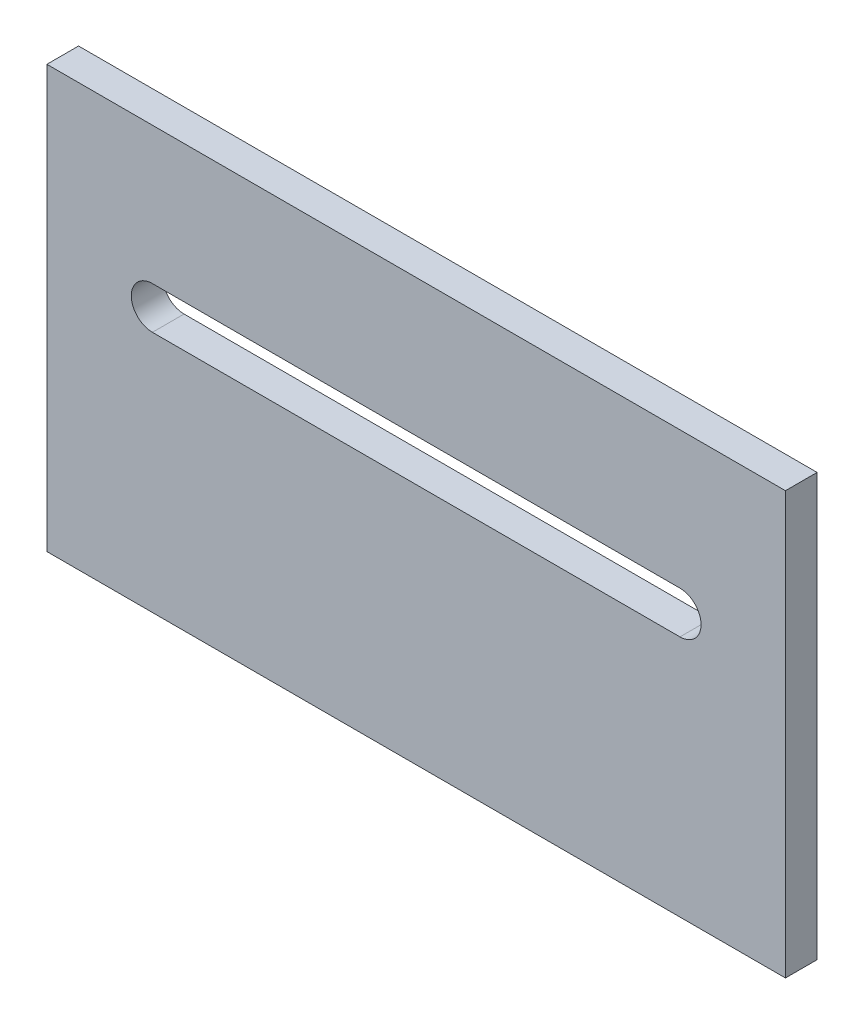
ISO-10303-21;
HEADER;
FILE_DESCRIPTION(('STEP AP214'),'2;1');
FILE_NAME('part.step','',(''),(''),'','','');
FILE_SCHEMA(('AUTOMOTIVE_DESIGN { 1 0 10303 214 1 1 1 1 }'));
ENDSEC;
DATA;
#1=APPLICATION_CONTEXT('core data for automotive mechanical design processes');
#2=APPLICATION_PROTOCOL_DEFINITION('international standard','automotive_design',2000,#1);
#3=PRODUCT_CONTEXT('',#1,'mechanical');
#4=PRODUCT('Part','Part','',(#3));
#5=PRODUCT_RELATED_PRODUCT_CATEGORY('part','',(#4));
#6=PRODUCT_DEFINITION_FORMATION('','',#4);
#7=PRODUCT_DEFINITION_CONTEXT('part definition',#1,'design');
#8=PRODUCT_DEFINITION('design','',#6,#7);
#9=PRODUCT_DEFINITION_SHAPE('','',#8);
#10=(LENGTH_UNIT() NAMED_UNIT(*) SI_UNIT(.MILLI.,.METRE.));
#11=(NAMED_UNIT(*) PLANE_ANGLE_UNIT() SI_UNIT($,.RADIAN.));
#12=(NAMED_UNIT(*) SI_UNIT($,.STERADIAN.) SOLID_ANGLE_UNIT());
#13=UNCERTAINTY_MEASURE_WITH_UNIT(LENGTH_MEASURE(1.E-05),#10,'distance_accuracy_value','');
#14=(GEOMETRIC_REPRESENTATION_CONTEXT(3) GLOBAL_UNCERTAINTY_ASSIGNED_CONTEXT((#13)) GLOBAL_UNIT_ASSIGNED_CONTEXT((#10,
#11,#12)) REPRESENTATION_CONTEXT('',''));
#15=CARTESIAN_POINT('',(0.,0.,0.));
#16=DIRECTION('',(0.,0.,1.));
#17=DIRECTION('',(1.,0.,0.));
#18=AXIS2_PLACEMENT_3D('',#15,#16,#17);
#19=CARTESIAN_POINT('',(0.,0.,3.));
#20=DIRECTION('',(1.,0.,0.));
#21=DIRECTION('',(0.,0.,-1.));
#22=AXIS2_PLACEMENT_3D('',#19,#20,#21);
#23=PLANE('',#22);
#24=DIRECTION('',(0.,-1.,0.));
#25=VECTOR('',#24,1.);
#26=CARTESIAN_POINT('',(0.,0.,0.));
#27=LINE('',#26,#25);
#28=CARTESIAN_POINT('',(0.,0.,0.));
#29=VERTEX_POINT('',#28);
#30=CARTESIAN_POINT('',(0.,-40.,0.));
#31=VERTEX_POINT('',#30);
#32=EDGE_CURVE('E134',#29,#31,#27,.T.);
#33=ORIENTED_EDGE('',*,*,#32,.T.);
#34=DIRECTION('',(0.,0.,-1.));
#35=VECTOR('',#34,1.);
#36=CARTESIAN_POINT('',(0.,-40.,3.));
#37=LINE('',#36,#35);
#38=CARTESIAN_POINT('',(0.,-40.,3.));
#39=VERTEX_POINT('',#38);
#40=EDGE_CURVE('E11',#39,#31,#37,.T.);
#41=ORIENTED_EDGE('',*,*,#40,.F.);
#42=DIRECTION('',(0.,-1.,0.));
#43=VECTOR('',#42,1.);
#44=CARTESIAN_POINT('',(0.,0.,3.));
#45=LINE('',#44,#43);
#46=CARTESIAN_POINT('',(0.,0.,3.));
#47=VERTEX_POINT('',#46);
#48=EDGE_CURVE('E138',#47,#39,#45,.T.);
#49=ORIENTED_EDGE('',*,*,#48,.F.);
#50=DIRECTION('',(0.,0.,-1.));
#51=VECTOR('',#50,1.);
#52=CARTESIAN_POINT('',(0.,0.,3.));
#53=LINE('',#52,#51);
#54=EDGE_CURVE('E148',#47,#29,#53,.T.);
#55=ORIENTED_EDGE('',*,*,#54,.T.);
#56=EDGE_LOOP('',(#33,#41,#49,#55));
#57=FACE_BOUND('',#56,.T.);
#58=ADVANCED_FACE('F37',(#57),#23,.F.);
#59=CARTESIAN_POINT('',(0.,-40.,3.));
#60=DIRECTION('',(0.,1.,0.));
#61=DIRECTION('',(0.,0.,1.));
#62=AXIS2_PLACEMENT_3D('',#59,#60,#61);
#63=PLANE('',#62);
#64=DIRECTION('',(1.,0.,0.));
#65=VECTOR('',#64,1.);
#66=CARTESIAN_POINT('',(0.,-40.,0.));
#67=LINE('',#66,#65);
#68=CARTESIAN_POINT('',(70.,-40.,0.));
#69=VERTEX_POINT('',#68);
#70=EDGE_CURVE('E151',#31,#69,#67,.T.);
#71=ORIENTED_EDGE('',*,*,#70,.T.);
#72=DIRECTION('',(0.,0.,-1.));
#73=VECTOR('',#72,1.);
#74=CARTESIAN_POINT('',(70.,-40.,3.));
#75=LINE('',#74,#73);
#76=CARTESIAN_POINT('',(70.,-40.,3.));
#77=VERTEX_POINT('',#76);
#78=EDGE_CURVE('E44',#77,#69,#75,.T.);
#79=ORIENTED_EDGE('',*,*,#78,.F.);
#80=DIRECTION('',(1.,0.,0.));
#81=VECTOR('',#80,1.);
#82=CARTESIAN_POINT('',(0.,-40.,3.));
#83=LINE('',#82,#81);
#84=EDGE_CURVE('E141',#39,#77,#83,.T.);
#85=ORIENTED_EDGE('',*,*,#84,.F.);
#86=ORIENTED_EDGE('',*,*,#40,.T.);
#87=EDGE_LOOP('',(#71,#79,#85,#86));
#88=FACE_BOUND('',#87,.T.);
#89=ADVANCED_FACE('F179',(#88),#63,.F.);
#90=CARTESIAN_POINT('',(70.,0.,3.));
#91=DIRECTION('',(-1.,0.,0.));
#92=DIRECTION('',(0.,-1.,0.));
#93=AXIS2_PLACEMENT_3D('',#90,#91,#92);
#94=PLANE('',#93);
#95=DIRECTION('',(0.,1.,0.));
#96=VECTOR('',#95,1.);
#97=CARTESIAN_POINT('',(70.,0.,0.));
#98=LINE('',#97,#96);
#99=CARTESIAN_POINT('',(70.,0.,0.));
#100=VERTEX_POINT('',#99);
#101=EDGE_CURVE('E153',#69,#100,#98,.T.);
#102=ORIENTED_EDGE('',*,*,#101,.T.);
#103=DIRECTION('',(0.,0.,-1.));
#104=VECTOR('',#103,1.);
#105=CARTESIAN_POINT('',(70.,0.,3.));
#106=LINE('',#105,#104);
#107=CARTESIAN_POINT('',(70.,0.,3.));
#108=VERTEX_POINT('',#107);
#109=EDGE_CURVE('E158',#108,#100,#106,.T.);
#110=ORIENTED_EDGE('',*,*,#109,.F.);
#111=DIRECTION('',(0.,1.,0.));
#112=VECTOR('',#111,1.);
#113=CARTESIAN_POINT('',(70.,0.,3.));
#114=LINE('',#113,#112);
#115=EDGE_CURVE('E144',#77,#108,#114,.T.);
#116=ORIENTED_EDGE('',*,*,#115,.F.);
#117=ORIENTED_EDGE('',*,*,#78,.T.);
#118=EDGE_LOOP('',(#102,#110,#116,#117));
#119=FACE_BOUND('',#118,.T.);
#120=ADVANCED_FACE('F165',(#119),#94,.F.);
#121=CARTESIAN_POINT('',(0.,0.,3.));
#122=DIRECTION('',(0.,-1.,0.));
#123=DIRECTION('',(0.,0.,-1.));
#124=AXIS2_PLACEMENT_3D('',#121,#122,#123);
#125=PLANE('',#124);
#126=DIRECTION('',(-1.,0.,0.));
#127=VECTOR('',#126,1.);
#128=CARTESIAN_POINT('',(0.,0.,0.));
#129=LINE('',#128,#127);
#130=EDGE_CURVE('E142',#100,#29,#129,.T.);
#131=ORIENTED_EDGE('',*,*,#130,.T.);
#132=ORIENTED_EDGE('',*,*,#54,.F.);
#133=DIRECTION('',(-1.,0.,0.));
#134=VECTOR('',#133,1.);
#135=CARTESIAN_POINT('',(0.,0.,3.));
#136=LINE('',#135,#134);
#137=EDGE_CURVE('E146',#108,#47,#136,.T.);
#138=ORIENTED_EDGE('',*,*,#137,.F.);
#139=ORIENTED_EDGE('',*,*,#109,.T.);
#140=EDGE_LOOP('',(#131,#132,#138,#139));
#141=FACE_BOUND('',#140,.T.);
#142=ADVANCED_FACE('F172',(#141),#125,.F.);
#143=CARTESIAN_POINT('',(0.,0.,3.));
#144=DIRECTION('',(0.,0.,1.));
#145=DIRECTION('',(1.,0.,0.));
#146=AXIS2_PLACEMENT_3D('',#143,#144,#145);
#147=PLANE('',#146);
#148=CARTESIAN_POINT('',(10.,-15.,3.));
#149=DIRECTION('',(0.,0.,1.));
#150=DIRECTION('',(1.,0.,0.));
#151=AXIS2_PLACEMENT_3D('',#148,#149,#150);
#152=CIRCLE('',#151,2.);
#153=CARTESIAN_POINT('',(10.,-13.,3.));
#154=VERTEX_POINT('',#153);
#155=CARTESIAN_POINT('',(10.,-17.,3.));
#156=VERTEX_POINT('',#155);
#157=EDGE_CURVE('E51',#154,#156,#152,.T.);
#158=ORIENTED_EDGE('',*,*,#157,.F.);
#159=DIRECTION('',(-1.,0.,0.));
#160=VECTOR('',#159,1.);
#161=CARTESIAN_POINT('',(10.,-13.,3.));
#162=LINE('',#161,#160);
#163=CARTESIAN_POINT('',(60.,-13.,3.));
#164=VERTEX_POINT('',#163);
#165=EDGE_CURVE('E119',#164,#154,#162,.T.);
#166=ORIENTED_EDGE('',*,*,#165,.F.);
#167=CARTESIAN_POINT('',(60.,-15.,3.));
#168=DIRECTION('',(0.,0.,1.));
#169=DIRECTION('',(1.,0.,0.));
#170=AXIS2_PLACEMENT_3D('',#167,#168,#169);
#171=CIRCLE('',#170,2.);
#172=CARTESIAN_POINT('',(60.,-17.,3.));
#173=VERTEX_POINT('',#172);
#174=EDGE_CURVE('E122',#173,#164,#171,.T.);
#175=ORIENTED_EDGE('',*,*,#174,.F.);
#176=DIRECTION('',(1.,0.,0.));
#177=VECTOR('',#176,1.);
#178=CARTESIAN_POINT('',(10.,-17.,3.));
#179=LINE('',#178,#177);
#180=EDGE_CURVE('E128',#156,#173,#179,.T.);
#181=ORIENTED_EDGE('',*,*,#180,.F.);
#182=EDGE_LOOP('',(#158,#166,#175,#181));
#183=FACE_BOUND('',#182,.T.);
#184=ORIENTED_EDGE('',*,*,#48,.T.);
#185=ORIENTED_EDGE('',*,*,#84,.T.);
#186=ORIENTED_EDGE('',*,*,#115,.T.);
#187=ORIENTED_EDGE('',*,*,#137,.T.);
#188=EDGE_LOOP('',(#184,#185,#186,#187));
#189=FACE_BOUND('',#188,.T.);
#190=ADVANCED_FACE('F178',(#183,#189),#147,.T.);
#191=CARTESIAN_POINT('',(0.,0.,0.));
#192=DIRECTION('',(0.,0.,1.));
#193=DIRECTION('',(1.,0.,0.));
#194=AXIS2_PLACEMENT_3D('',#191,#192,#193);
#195=PLANE('',#194);
#196=DIRECTION('',(-1.,0.,0.));
#197=VECTOR('',#196,1.);
#198=CARTESIAN_POINT('',(10.,-13.,0.));
#199=LINE('',#198,#197);
#200=CARTESIAN_POINT('',(60.,-13.,0.));
#201=VERTEX_POINT('',#200);
#202=CARTESIAN_POINT('',(10.,-13.,0.));
#203=VERTEX_POINT('',#202);
#204=EDGE_CURVE('E109',#201,#203,#199,.T.);
#205=ORIENTED_EDGE('',*,*,#204,.T.);
#206=CARTESIAN_POINT('',(10.,-15.,0.));
#207=DIRECTION('',(0.,0.,1.));
#208=DIRECTION('',(1.,0.,0.));
#209=AXIS2_PLACEMENT_3D('',#206,#207,#208);
#210=CIRCLE('',#209,2.);
#211=CARTESIAN_POINT('',(10.,-17.,0.));
#212=VERTEX_POINT('',#211);
#213=EDGE_CURVE('E103',#203,#212,#210,.T.);
#214=ORIENTED_EDGE('',*,*,#213,.T.);
#215=DIRECTION('',(1.,0.,0.));
#216=VECTOR('',#215,1.);
#217=CARTESIAN_POINT('',(10.,-17.,0.));
#218=LINE('',#217,#216);
#219=CARTESIAN_POINT('',(60.,-17.,0.));
#220=VERTEX_POINT('',#219);
#221=EDGE_CURVE('E112',#212,#220,#218,.T.);
#222=ORIENTED_EDGE('',*,*,#221,.T.);
#223=CARTESIAN_POINT('',(60.,-15.,0.));
#224=DIRECTION('',(0.,0.,1.));
#225=DIRECTION('',(1.,0.,0.));
#226=AXIS2_PLACEMENT_3D('',#223,#224,#225);
#227=CIRCLE('',#226,2.);
#228=EDGE_CURVE('E59',#220,#201,#227,.T.);
#229=ORIENTED_EDGE('',*,*,#228,.T.);
#230=EDGE_LOOP('',(#205,#214,#222,#229));
#231=FACE_BOUND('',#230,.T.);
#232=ORIENTED_EDGE('',*,*,#32,.F.);
#233=ORIENTED_EDGE('',*,*,#130,.F.);
#234=ORIENTED_EDGE('',*,*,#101,.F.);
#235=ORIENTED_EDGE('',*,*,#70,.F.);
#236=EDGE_LOOP('',(#232,#233,#234,#235));
#237=FACE_BOUND('',#236,.T.);
#238=ADVANCED_FACE('F116',(#231,#237),#195,.F.);
#239=CARTESIAN_POINT('',(10.,-15.,0.));
#240=DIRECTION('',(0.,0.,1.));
#241=DIRECTION('',(1.,0.,0.));
#242=AXIS2_PLACEMENT_3D('',#239,#240,#241);
#243=CYLINDRICAL_SURFACE('',#242,2.);
#244=ORIENTED_EDGE('',*,*,#157,.T.);
#245=DIRECTION('',(0.,0.,1.));
#246=VECTOR('',#245,1.);
#247=CARTESIAN_POINT('',(10.,-17.,0.));
#248=LINE('',#247,#246);
#249=EDGE_CURVE('E99',#212,#156,#248,.T.);
#250=ORIENTED_EDGE('',*,*,#249,.F.);
#251=ORIENTED_EDGE('',*,*,#213,.F.);
#252=DIRECTION('',(0.,0.,1.));
#253=VECTOR('',#252,1.);
#254=CARTESIAN_POINT('',(10.,-13.,0.));
#255=LINE('',#254,#253);
#256=EDGE_CURVE('E132',#203,#154,#255,.T.);
#257=ORIENTED_EDGE('',*,*,#256,.T.);
#258=EDGE_LOOP('',(#244,#250,#251,#257));
#259=FACE_BOUND('',#258,.T.);
#260=ADVANCED_FACE('F101',(#259),#243,.F.);
#261=CARTESIAN_POINT('',(10.,-13.,0.));
#262=DIRECTION('',(0.,1.,0.));
#263=DIRECTION('',(0.,0.,1.));
#264=AXIS2_PLACEMENT_3D('',#261,#262,#263);
#265=PLANE('',#264);
#266=ORIENTED_EDGE('',*,*,#165,.T.);
#267=ORIENTED_EDGE('',*,*,#256,.F.);
#268=ORIENTED_EDGE('',*,*,#204,.F.);
#269=DIRECTION('',(0.,0.,1.));
#270=VECTOR('',#269,1.);
#271=CARTESIAN_POINT('',(60.,-13.,0.));
#272=LINE('',#271,#270);
#273=EDGE_CURVE('E135',#201,#164,#272,.T.);
#274=ORIENTED_EDGE('',*,*,#273,.T.);
#275=EDGE_LOOP('',(#266,#267,#268,#274));
#276=FACE_BOUND('',#275,.T.);
#277=ADVANCED_FACE('F196',(#276),#265,.F.);
#278=CARTESIAN_POINT('',(60.,-15.,0.));
#279=DIRECTION('',(0.,0.,1.));
#280=DIRECTION('',(1.,0.,0.));
#281=AXIS2_PLACEMENT_3D('',#278,#279,#280);
#282=CYLINDRICAL_SURFACE('',#281,2.);
#283=ORIENTED_EDGE('',*,*,#174,.T.);
#284=ORIENTED_EDGE('',*,*,#273,.F.);
#285=ORIENTED_EDGE('',*,*,#228,.F.);
#286=DIRECTION('',(0.,0.,1.));
#287=VECTOR('',#286,1.);
#288=CARTESIAN_POINT('',(60.,-17.,0.));
#289=LINE('',#288,#287);
#290=EDGE_CURVE('E108',#220,#173,#289,.T.);
#291=ORIENTED_EDGE('',*,*,#290,.T.);
#292=EDGE_LOOP('',(#283,#284,#285,#291));
#293=FACE_BOUND('',#292,.T.);
#294=ADVANCED_FACE('F199',(#293),#282,.F.);
#295=CARTESIAN_POINT('',(10.,-17.,0.));
#296=DIRECTION('',(0.,-1.,0.));
#297=DIRECTION('',(0.,0.,-1.));
#298=AXIS2_PLACEMENT_3D('',#295,#296,#297);
#299=PLANE('',#298);
#300=ORIENTED_EDGE('',*,*,#180,.T.);
#301=ORIENTED_EDGE('',*,*,#290,.F.);
#302=ORIENTED_EDGE('',*,*,#221,.F.);
#303=ORIENTED_EDGE('',*,*,#249,.T.);
#304=EDGE_LOOP('',(#300,#301,#302,#303));
#305=FACE_BOUND('',#304,.T.);
#306=ADVANCED_FACE('F113',(#305),#299,.F.);
#307=CLOSED_SHELL('',(#58,#89,#120,#142,#190,#238,#260,#277,#294,#306));
#308=MANIFOLD_SOLID_BREP('B2',#307);
#309=ADVANCED_BREP_SHAPE_REPRESENTATION('',(#18,#308),#14);
#310=SHAPE_DEFINITION_REPRESENTATION(#9,#309);
ENDSEC;
END-ISO-10303-21;
